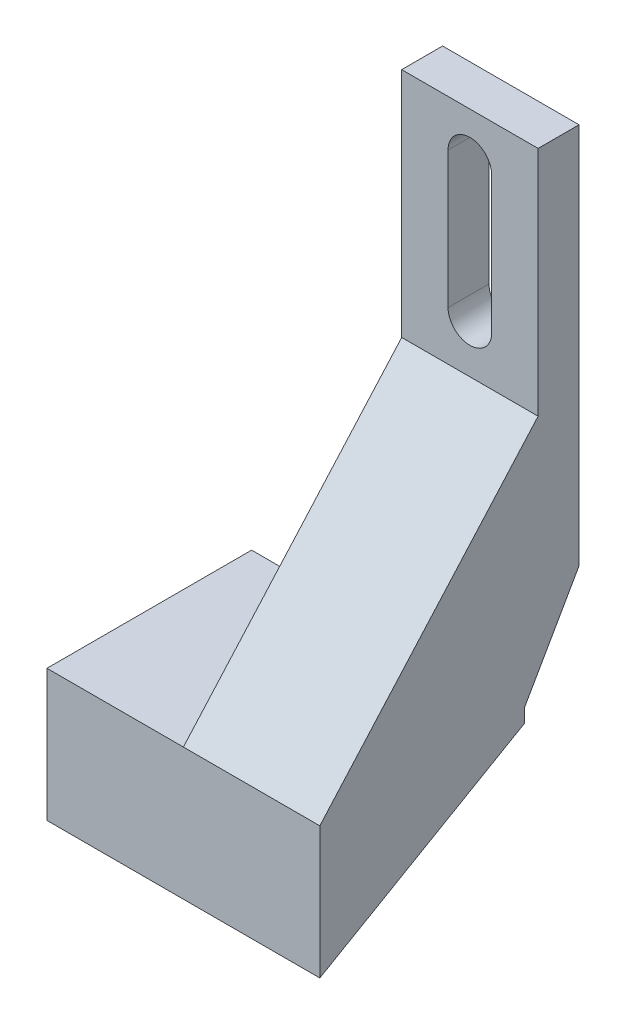
ISO-10303-21;
HEADER;
FILE_DESCRIPTION(('STEP AP214'),'2;1');
FILE_NAME('part.step','',(''),(''),'','','');
FILE_SCHEMA(('AUTOMOTIVE_DESIGN { 1 0 10303 214 1 1 1 1 }'));
ENDSEC;
DATA;
#1=APPLICATION_CONTEXT('core data for automotive mechanical design processes');
#2=APPLICATION_PROTOCOL_DEFINITION('international standard','automotive_design',2000,#1);
#3=PRODUCT_CONTEXT('',#1,'mechanical');
#4=PRODUCT('Part','Part','',(#3));
#5=PRODUCT_RELATED_PRODUCT_CATEGORY('part','',(#4));
#6=PRODUCT_DEFINITION_FORMATION('','',#4);
#7=PRODUCT_DEFINITION_CONTEXT('part definition',#1,'design');
#8=PRODUCT_DEFINITION('design','',#6,#7);
#9=PRODUCT_DEFINITION_SHAPE('','',#8);
#10=(LENGTH_UNIT() NAMED_UNIT(*) SI_UNIT(.MILLI.,.METRE.));
#11=(NAMED_UNIT(*) PLANE_ANGLE_UNIT() SI_UNIT($,.RADIAN.));
#12=(NAMED_UNIT(*) SI_UNIT($,.STERADIAN.) SOLID_ANGLE_UNIT());
#13=UNCERTAINTY_MEASURE_WITH_UNIT(LENGTH_MEASURE(1.E-05),#10,'distance_accuracy_value','');
#14=(GEOMETRIC_REPRESENTATION_CONTEXT(3) GLOBAL_UNCERTAINTY_ASSIGNED_CONTEXT((#13)) GLOBAL_UNIT_ASSIGNED_CONTEXT((#10,
#11,#12)) REPRESENTATION_CONTEXT('',''));
#15=CARTESIAN_POINT('',(0.,0.,0.));
#16=DIRECTION('',(0.,0.,1.));
#17=DIRECTION('',(1.,0.,0.));
#18=AXIS2_PLACEMENT_3D('',#15,#16,#17);
#19=CARTESIAN_POINT('',(0.,0.,3.));
#20=DIRECTION('',(0.,0.,1.));
#21=DIRECTION('',(1.,0.,0.));
#22=AXIS2_PLACEMENT_3D('',#19,#20,#21);
#23=PLANE('',#22);
#24=CARTESIAN_POINT('',(0.,21.6,3.));
#25=DIRECTION('',(0.,0.,1.));
#26=DIRECTION('',(1.,0.,0.));
#27=AXIS2_PLACEMENT_3D('',#24,#25,#26);
#28=CIRCLE('',#27,1.6);
#29=CARTESIAN_POINT('',(-1.6,21.6,3.));
#30=VERTEX_POINT('',#29);
#31=CARTESIAN_POINT('',(1.6,21.6,3.));
#32=VERTEX_POINT('',#31);
#33=EDGE_CURVE('E189',#30,#32,#28,.T.);
#34=ORIENTED_EDGE('',*,*,#33,.F.);
#35=DIRECTION('',(0.,-1.,0.));
#36=VECTOR('',#35,1.);
#37=CARTESIAN_POINT('',(-1.6,0.,3.));
#38=LINE('',#37,#36);
#39=CARTESIAN_POINT('',(-1.6,31.6,3.));
#40=VERTEX_POINT('',#39);
#41=EDGE_CURVE('E192',#40,#30,#38,.T.);
#42=ORIENTED_EDGE('',*,*,#41,.F.);
#43=CARTESIAN_POINT('',(0.,31.6,3.));
#44=DIRECTION('',(0.,0.,1.));
#45=DIRECTION('',(1.,0.,0.));
#46=AXIS2_PLACEMENT_3D('',#43,#44,#45);
#47=CIRCLE('',#46,1.6);
#48=CARTESIAN_POINT('',(1.6,31.6,3.));
#49=VERTEX_POINT('',#48);
#50=EDGE_CURVE('E196',#49,#40,#47,.T.);
#51=ORIENTED_EDGE('',*,*,#50,.F.);
#52=DIRECTION('',(0.,-1.,0.));
#53=VECTOR('',#52,1.);
#54=CARTESIAN_POINT('',(1.6,0.,3.));
#55=LINE('',#54,#53);
#56=EDGE_CURVE('E199',#49,#32,#55,.T.);
#57=ORIENTED_EDGE('',*,*,#56,.T.);
#58=EDGE_LOOP('',(#34,#42,#51,#57));
#59=FACE_BOUND('',#58,.T.);
#60=DIRECTION('',(0.,1.,0.));
#61=VECTOR('',#60,1.);
#62=CARTESIAN_POINT('',(-5.,0.,3.));
#63=LINE('',#62,#61);
#64=CARTESIAN_POINT('',(-5.,18.,3.));
#65=VERTEX_POINT('',#64);
#66=CARTESIAN_POINT('',(-5.,35.,3.));
#67=VERTEX_POINT('',#66);
#68=EDGE_CURVE('E58',#65,#67,#63,.T.);
#69=ORIENTED_EDGE('',*,*,#68,.F.);
#70=DIRECTION('',(-1.,0.,0.));
#71=VECTOR('',#70,1.);
#72=CARTESIAN_POINT('',(31.1725046566048,18.,3.));
#73=LINE('',#72,#71);
#74=CARTESIAN_POINT('',(5.,18.,3.));
#75=VERTEX_POINT('',#74);
#76=EDGE_CURVE('E53',#75,#65,#73,.T.);
#77=ORIENTED_EDGE('',*,*,#76,.F.);
#78=DIRECTION('',(0.,1.,0.));
#79=VECTOR('',#78,1.);
#80=CARTESIAN_POINT('',(5.,0.,3.));
#81=LINE('',#80,#79);
#82=CARTESIAN_POINT('',(5.,35.,3.));
#83=VERTEX_POINT('',#82);
#84=EDGE_CURVE('E202',#75,#83,#81,.T.);
#85=ORIENTED_EDGE('',*,*,#84,.T.);
#86=DIRECTION('',(1.,0.,0.));
#87=VECTOR('',#86,1.);
#88=CARTESIAN_POINT('',(0.,35.,3.));
#89=LINE('',#88,#87);
#90=EDGE_CURVE('E204',#67,#83,#89,.T.);
#91=ORIENTED_EDGE('',*,*,#90,.F.);
#92=EDGE_LOOP('',(#69,#77,#85,#91));
#93=FACE_BOUND('',#92,.T.);
#94=ADVANCED_FACE('F36',(#59,#93),#23,.T.);
#95=CARTESIAN_POINT('',(-5.,0.,3.));
#96=DIRECTION('',(-1.,0.,0.));
#97=DIRECTION('',(0.,0.,1.));
#98=AXIS2_PLACEMENT_3D('',#95,#96,#97);
#99=PLANE('',#98);
#100=DIRECTION('',(0.,-0.74740931868366,0.66436383882992));
#101=VECTOR('',#100,1.);
#102=CARTESIAN_POINT('',(-5.,9.43448275862069,10.6137931034483));
#103=LINE('',#102,#101);
#104=CARTESIAN_POINT('',(-5.,0.,19.));
#105=VERTEX_POINT('',#104);
#106=EDGE_CURVE('E154',#65,#105,#103,.T.);
#107=ORIENTED_EDGE('',*,*,#106,.F.);
#108=ORIENTED_EDGE('',*,*,#68,.T.);
#109=DIRECTION('',(0.,0.,-1.));
#110=VECTOR('',#109,1.);
#111=CARTESIAN_POINT('',(-5.,35.,3.));
#112=LINE('',#111,#110);
#113=CARTESIAN_POINT('',(-5.,35.,0.));
#114=VERTEX_POINT('',#113);
#115=EDGE_CURVE('E45',#67,#114,#112,.T.);
#116=ORIENTED_EDGE('',*,*,#115,.T.);
#117=DIRECTION('',(0.,1.,0.));
#118=VECTOR('',#117,1.);
#119=CARTESIAN_POINT('',(-5.,0.,0.));
#120=LINE('',#119,#118);
#121=CARTESIAN_POINT('',(-5.,7.,0.));
#122=VERTEX_POINT('',#121);
#123=EDGE_CURVE('E219',#122,#114,#120,.T.);
#124=ORIENTED_EDGE('',*,*,#123,.F.);
#125=DIRECTION('',(0.,-0.868243142124459,0.496138938356834));
#126=VECTOR('',#125,1.);
#127=CARTESIAN_POINT('',(-5.,1.72307692307692,3.01538461538461));
#128=LINE('',#127,#126);
#129=CARTESIAN_POINT('',(-5.,0.,4.));
#130=VERTEX_POINT('',#129);
#131=EDGE_CURVE('E424',#122,#130,#128,.T.);
#132=ORIENTED_EDGE('',*,*,#131,.T.);
#133=DIRECTION('',(0.,0.,-1.));
#134=VECTOR('',#133,1.);
#135=CARTESIAN_POINT('',(-5.,0.,0.));
#136=LINE('',#135,#134);
#137=EDGE_CURVE('E142',#105,#130,#136,.T.);
#138=ORIENTED_EDGE('',*,*,#137,.F.);
#139=EDGE_LOOP('',(#107,#108,#116,#124,#132,#138));
#140=FACE_BOUND('',#139,.T.);
#141=ADVANCED_FACE('F251',(#140),#99,.T.);
#142=CARTESIAN_POINT('',(5.,0.,3.));
#143=DIRECTION('',(-1.,0.,0.));
#144=DIRECTION('',(0.,-1.,0.));
#145=AXIS2_PLACEMENT_3D('',#142,#143,#144);
#146=PLANE('',#145);
#147=DIRECTION('',(0.,0.868243142124459,-0.496138938356834));
#148=VECTOR('',#147,1.);
#149=CARTESIAN_POINT('',(5.,1.72307692307692,3.01538461538462));
#150=LINE('',#149,#148);
#151=CARTESIAN_POINT('',(5.,0.,4.));
#152=VERTEX_POINT('',#151);
#153=CARTESIAN_POINT('',(5.,7.,0.));
#154=VERTEX_POINT('',#153);
#155=EDGE_CURVE('E135',#152,#154,#150,.T.);
#156=ORIENTED_EDGE('',*,*,#155,.T.);
#157=DIRECTION('',(0.,1.,0.));
#158=VECTOR('',#157,1.);
#159=CARTESIAN_POINT('',(5.,0.,0.));
#160=LINE('',#159,#158);
#161=CARTESIAN_POINT('',(5.,35.,0.));
#162=VERTEX_POINT('',#161);
#163=EDGE_CURVE('E222',#154,#162,#160,.T.);
#164=ORIENTED_EDGE('',*,*,#163,.T.);
#165=DIRECTION('',(0.,0.,-1.));
#166=VECTOR('',#165,1.);
#167=CARTESIAN_POINT('',(5.,35.,3.));
#168=LINE('',#167,#166);
#169=EDGE_CURVE('E11',#83,#162,#168,.T.);
#170=ORIENTED_EDGE('',*,*,#169,.F.);
#171=ORIENTED_EDGE('',*,*,#84,.F.);
#172=DIRECTION('',(0.,0.74740931868366,-0.66436383882992));
#173=VECTOR('',#172,1.);
#174=CARTESIAN_POINT('',(5.,9.43448275862069,10.6137931034483));
#175=LINE('',#174,#173);
#176=CARTESIAN_POINT('',(5.,0.,19.));
#177=VERTEX_POINT('',#176);
#178=EDGE_CURVE('E160',#177,#75,#175,.T.);
#179=ORIENTED_EDGE('',*,*,#178,.F.);
#180=DIRECTION('',(0.,1.,0.));
#181=VECTOR('',#180,1.);
#182=CARTESIAN_POINT('',(5.,0.,19.));
#183=LINE('',#182,#181);
#184=CARTESIAN_POINT('',(5.00000000000001,-9.66025403784427,19.));
#185=VERTEX_POINT('',#184);
#186=EDGE_CURVE('E159',#185,#177,#183,.T.);
#187=ORIENTED_EDGE('',*,*,#186,.F.);
#188=DIRECTION('',(0.,-0.499999999999995,0.866025403784442));
#189=VECTOR('',#188,1.);
#190=CARTESIAN_POINT('',(5.,0.982050807568862,0.566987298107764));
#191=LINE('',#190,#189);
#192=CARTESIAN_POINT('',(5.,-0.999999999999999,4.));
#193=VERTEX_POINT('',#192);
#194=EDGE_CURVE('E138',#193,#185,#191,.T.);
#195=ORIENTED_EDGE('',*,*,#194,.F.);
#196=DIRECTION('',(0.,-1.,0.));
#197=VECTOR('',#196,1.);
#198=CARTESIAN_POINT('',(5.,0.,4.));
#199=LINE('',#198,#197);
#200=EDGE_CURVE('E130',#152,#193,#199,.T.);
#201=ORIENTED_EDGE('',*,*,#200,.F.);
#202=EDGE_LOOP('',(#156,#164,#170,#171,#179,#187,#195,#201));
#203=FACE_BOUND('',#202,.T.);
#204=ADVANCED_FACE('F132',(#203),#146,.F.);
#205=CARTESIAN_POINT('',(0.,21.6,3.));
#206=DIRECTION('',(0.,0.,-1.));
#207=DIRECTION('',(-1.,0.,0.));
#208=AXIS2_PLACEMENT_3D('',#205,#206,#207);
#209=CYLINDRICAL_SURFACE('',#208,1.6);
#210=CARTESIAN_POINT('',(0.,21.6,0.));
#211=DIRECTION('',(0.,0.,1.));
#212=DIRECTION('',(1.,0.,0.));
#213=AXIS2_PLACEMENT_3D('',#210,#211,#212);
#214=CIRCLE('',#213,1.6);
#215=CARTESIAN_POINT('',(-1.6,21.6,0.));
#216=VERTEX_POINT('',#215);
#217=CARTESIAN_POINT('',(1.6,21.6,0.));
#218=VERTEX_POINT('',#217);
#219=EDGE_CURVE('E188',#216,#218,#214,.T.);
#220=ORIENTED_EDGE('',*,*,#219,.F.);
#221=DIRECTION('',(0.,0.,-1.));
#222=VECTOR('',#221,1.);
#223=CARTESIAN_POINT('',(-1.6,21.6,3.));
#224=LINE('',#223,#222);
#225=EDGE_CURVE('E40',#30,#216,#224,.T.);
#226=ORIENTED_EDGE('',*,*,#225,.F.);
#227=ORIENTED_EDGE('',*,*,#33,.T.);
#228=DIRECTION('',(0.,0.,-1.));
#229=VECTOR('',#228,1.);
#230=CARTESIAN_POINT('',(1.6,21.6,3.));
#231=LINE('',#230,#229);
#232=EDGE_CURVE('E207',#32,#218,#231,.T.);
#233=ORIENTED_EDGE('',*,*,#232,.T.);
#234=EDGE_LOOP('',(#220,#226,#227,#233));
#235=FACE_BOUND('',#234,.T.);
#236=ADVANCED_FACE('F38',(#235),#209,.F.);
#237=CARTESIAN_POINT('',(-1.6,0.,3.));
#238=DIRECTION('',(1.,0.,0.));
#239=DIRECTION('',(0.,1.,0.));
#240=AXIS2_PLACEMENT_3D('',#237,#238,#239);
#241=PLANE('',#240);
#242=DIRECTION('',(0.,-1.,0.));
#243=VECTOR('',#242,1.);
#244=CARTESIAN_POINT('',(-1.6,0.,0.));
#245=LINE('',#244,#243);
#246=CARTESIAN_POINT('',(-1.6,31.6,0.));
#247=VERTEX_POINT('',#246);
#248=EDGE_CURVE('E210',#247,#216,#245,.T.);
#249=ORIENTED_EDGE('',*,*,#248,.F.);
#250=DIRECTION('',(0.,0.,-1.));
#251=VECTOR('',#250,1.);
#252=CARTESIAN_POINT('',(-1.6,31.6,3.));
#253=LINE('',#252,#251);
#254=EDGE_CURVE('E229',#40,#247,#253,.T.);
#255=ORIENTED_EDGE('',*,*,#254,.F.);
#256=ORIENTED_EDGE('',*,*,#41,.T.);
#257=ORIENTED_EDGE('',*,*,#225,.T.);
#258=EDGE_LOOP('',(#249,#255,#256,#257));
#259=FACE_BOUND('',#258,.T.);
#260=ADVANCED_FACE('F235',(#259),#241,.T.);
#261=CARTESIAN_POINT('',(0.,31.6,3.));
#262=DIRECTION('',(0.,0.,-1.));
#263=DIRECTION('',(-1.,0.,0.));
#264=AXIS2_PLACEMENT_3D('',#261,#262,#263);
#265=CYLINDRICAL_SURFACE('',#264,1.6);
#266=CARTESIAN_POINT('',(0.,31.6,0.));
#267=DIRECTION('',(0.,0.,1.));
#268=DIRECTION('',(1.,0.,0.));
#269=AXIS2_PLACEMENT_3D('',#266,#267,#268);
#270=CIRCLE('',#269,1.6);
#271=CARTESIAN_POINT('',(1.6,31.6,0.));
#272=VERTEX_POINT('',#271);
#273=EDGE_CURVE('E213',#272,#247,#270,.T.);
#274=ORIENTED_EDGE('',*,*,#273,.F.);
#275=DIRECTION('',(0.,0.,-1.));
#276=VECTOR('',#275,1.);
#277=CARTESIAN_POINT('',(1.6,31.6,3.));
#278=LINE('',#277,#276);
#279=EDGE_CURVE('E228',#49,#272,#278,.T.);
#280=ORIENTED_EDGE('',*,*,#279,.F.);
#281=ORIENTED_EDGE('',*,*,#50,.T.);
#282=ORIENTED_EDGE('',*,*,#254,.T.);
#283=EDGE_LOOP('',(#274,#280,#281,#282));
#284=FACE_BOUND('',#283,.T.);
#285=ADVANCED_FACE('F244',(#284),#265,.F.);
#286=CARTESIAN_POINT('',(1.6,0.,3.));
#287=DIRECTION('',(1.,0.,0.));
#288=DIRECTION('',(0.,1.,0.));
#289=AXIS2_PLACEMENT_3D('',#286,#287,#288);
#290=PLANE('',#289);
#291=DIRECTION('',(0.,-1.,0.));
#292=VECTOR('',#291,1.);
#293=CARTESIAN_POINT('',(1.6,0.,0.));
#294=LINE('',#293,#292);
#295=EDGE_CURVE('E216',#272,#218,#294,.T.);
#296=ORIENTED_EDGE('',*,*,#295,.T.);
#297=ORIENTED_EDGE('',*,*,#232,.F.);
#298=ORIENTED_EDGE('',*,*,#56,.F.);
#299=ORIENTED_EDGE('',*,*,#279,.T.);
#300=EDGE_LOOP('',(#296,#297,#298,#299));
#301=FACE_BOUND('',#300,.T.);
#302=ADVANCED_FACE('F248',(#301),#290,.F.);
#303=CARTESIAN_POINT('',(0.,35.,3.));
#304=DIRECTION('',(0.,1.,0.));
#305=DIRECTION('',(0.,0.,1.));
#306=AXIS2_PLACEMENT_3D('',#303,#304,#305);
#307=PLANE('',#306);
#308=DIRECTION('',(1.,0.,0.));
#309=VECTOR('',#308,1.);
#310=CARTESIAN_POINT('',(0.,35.,0.));
#311=LINE('',#310,#309);
#312=EDGE_CURVE('E193',#114,#162,#311,.T.);
#313=ORIENTED_EDGE('',*,*,#312,.F.);
#314=ORIENTED_EDGE('',*,*,#115,.F.);
#315=ORIENTED_EDGE('',*,*,#90,.T.);
#316=ORIENTED_EDGE('',*,*,#169,.T.);
#317=EDGE_LOOP('',(#313,#314,#315,#316));
#318=FACE_BOUND('',#317,.T.);
#319=ADVANCED_FACE('F263',(#318),#307,.T.);
#320=CARTESIAN_POINT('',(0.,0.,0.));
#321=DIRECTION('',(0.,0.,1.));
#322=DIRECTION('',(1.,0.,0.));
#323=AXIS2_PLACEMENT_3D('',#320,#321,#322);
#324=PLANE('',#323);
#325=ORIENTED_EDGE('',*,*,#219,.T.);
#326=ORIENTED_EDGE('',*,*,#295,.F.);
#327=ORIENTED_EDGE('',*,*,#273,.T.);
#328=ORIENTED_EDGE('',*,*,#248,.T.);
#329=EDGE_LOOP('',(#325,#326,#327,#328));
#330=FACE_BOUND('',#329,.T.);
#331=ORIENTED_EDGE('',*,*,#123,.T.);
#332=ORIENTED_EDGE('',*,*,#312,.T.);
#333=ORIENTED_EDGE('',*,*,#163,.F.);
#334=DIRECTION('',(1.,0.,0.));
#335=VECTOR('',#334,1.);
#336=CARTESIAN_POINT('',(-5.,7.,0.));
#337=LINE('',#336,#335);
#338=EDGE_CURVE('E158',#122,#154,#337,.T.);
#339=ORIENTED_EDGE('',*,*,#338,.F.);
#340=EDGE_LOOP('',(#331,#332,#333,#339));
#341=FACE_BOUND('',#340,.T.);
#342=ADVANCED_FACE('F242',(#330,#341),#324,.F.);
#343=CARTESIAN_POINT('',(-5.,0.,4.));
#344=DIRECTION('',(0.,0.,1.));
#345=DIRECTION('',(0.,-1.,0.));
#346=AXIS2_PLACEMENT_3D('',#343,#344,#345);
#347=PLANE('',#346);
#348=DIRECTION('',(1.,0.,0.));
#349=VECTOR('',#348,1.);
#350=CARTESIAN_POINT('',(-15.,0.,4.));
#351=LINE('',#350,#349);
#352=CARTESIAN_POINT('',(-15.,0.,4.));
#353=VERTEX_POINT('',#352);
#354=EDGE_CURVE('E143',#353,#130,#351,.T.);
#355=ORIENTED_EDGE('',*,*,#354,.T.);
#356=DIRECTION('',(-1.,0.,0.));
#357=VECTOR('',#356,1.);
#358=CARTESIAN_POINT('',(31.1725046566048,0.,4.));
#359=LINE('',#358,#357);
#360=EDGE_CURVE('E147',#152,#130,#359,.T.);
#361=ORIENTED_EDGE('',*,*,#360,.F.);
#362=ORIENTED_EDGE('',*,*,#200,.T.);
#363=DIRECTION('',(1.,0.,0.));
#364=VECTOR('',#363,1.);
#365=CARTESIAN_POINT('',(-15.,-1.,4.));
#366=LINE('',#365,#364);
#367=CARTESIAN_POINT('',(-15.,-1.,4.));
#368=VERTEX_POINT('',#367);
#369=EDGE_CURVE('E179',#368,#193,#366,.T.);
#370=ORIENTED_EDGE('',*,*,#369,.F.);
#371=DIRECTION('',(0.,-1.,0.));
#372=VECTOR('',#371,1.);
#373=CARTESIAN_POINT('',(-15.,0.,4.));
#374=LINE('',#373,#372);
#375=EDGE_CURVE('E174',#353,#368,#374,.T.);
#376=ORIENTED_EDGE('',*,*,#375,.F.);
#377=EDGE_LOOP('',(#355,#361,#362,#370,#376));
#378=FACE_BOUND('',#377,.T.);
#379=ADVANCED_FACE('F148',(#378),#347,.F.);
#380=CARTESIAN_POINT('',(-15.,0.,0.));
#381=DIRECTION('',(0.,-1.,0.));
#382=DIRECTION('',(1.,0.,0.));
#383=AXIS2_PLACEMENT_3D('',#380,#381,#382);
#384=PLANE('',#383);
#385=DIRECTION('',(1.,0.,0.));
#386=VECTOR('',#385,1.);
#387=CARTESIAN_POINT('',(-15.,0.,19.));
#388=LINE('',#387,#386);
#389=CARTESIAN_POINT('',(-15.,0.,19.));
#390=VERTEX_POINT('',#389);
#391=EDGE_CURVE('E175',#390,#105,#388,.T.);
#392=ORIENTED_EDGE('',*,*,#391,.T.);
#393=ORIENTED_EDGE('',*,*,#137,.T.);
#394=ORIENTED_EDGE('',*,*,#354,.F.);
#395=DIRECTION('',(0.,0.,-1.));
#396=VECTOR('',#395,1.);
#397=CARTESIAN_POINT('',(-15.,0.,0.));
#398=LINE('',#397,#396);
#399=EDGE_CURVE('E167',#390,#353,#398,.T.);
#400=ORIENTED_EDGE('',*,*,#399,.F.);
#401=EDGE_LOOP('',(#392,#393,#394,#400));
#402=FACE_BOUND('',#401,.T.);
#403=ADVANCED_FACE('F318',(#402),#384,.F.);
#404=CARTESIAN_POINT('',(-15.,0.982050807568859,0.566987298107764));
#405=DIRECTION('',(0.,0.866025403784442,0.499999999999995));
#406=DIRECTION('',(0.,-0.499999999999995,0.866025403784442));
#407=AXIS2_PLACEMENT_3D('',#404,#405,#406);
#408=PLANE('',#407);
#409=ORIENTED_EDGE('',*,*,#194,.T.);
#410=DIRECTION('',(1.,0.,0.));
#411=VECTOR('',#410,1.);
#412=CARTESIAN_POINT('',(-15.,-9.66025403784428,19.));
#413=LINE('',#412,#411);
#414=CARTESIAN_POINT('',(-15.,-9.66025403784428,19.));
#415=VERTEX_POINT('',#414);
#416=EDGE_CURVE('E181',#415,#185,#413,.T.);
#417=ORIENTED_EDGE('',*,*,#416,.F.);
#418=DIRECTION('',(0.,-0.499999999999995,0.866025403784442));
#419=VECTOR('',#418,1.);
#420=CARTESIAN_POINT('',(-15.,0.982050807568859,0.566987298107764));
#421=LINE('',#420,#419);
#422=EDGE_CURVE('E172',#368,#415,#421,.T.);
#423=ORIENTED_EDGE('',*,*,#422,.F.);
#424=ORIENTED_EDGE('',*,*,#369,.T.);
#425=EDGE_LOOP('',(#409,#417,#423,#424));
#426=FACE_BOUND('',#425,.T.);
#427=ADVANCED_FACE('F313',(#426),#408,.F.);
#428=CARTESIAN_POINT('',(-15.,0.,19.));
#429=DIRECTION('',(0.,0.,-1.));
#430=DIRECTION('',(0.,1.,0.));
#431=AXIS2_PLACEMENT_3D('',#428,#429,#430);
#432=PLANE('',#431);
#433=ORIENTED_EDGE('',*,*,#186,.T.);
#434=DIRECTION('',(-1.,0.,0.));
#435=VECTOR('',#434,1.);
#436=CARTESIAN_POINT('',(31.1725046566048,0.,19.));
#437=LINE('',#436,#435);
#438=EDGE_CURVE('E153',#177,#105,#437,.T.);
#439=ORIENTED_EDGE('',*,*,#438,.T.);
#440=ORIENTED_EDGE('',*,*,#391,.F.);
#441=DIRECTION('',(0.,1.,0.));
#442=VECTOR('',#441,1.);
#443=CARTESIAN_POINT('',(-15.,0.,19.));
#444=LINE('',#443,#442);
#445=EDGE_CURVE('E170',#415,#390,#444,.T.);
#446=ORIENTED_EDGE('',*,*,#445,.F.);
#447=ORIENTED_EDGE('',*,*,#416,.T.);
#448=EDGE_LOOP('',(#433,#439,#440,#446,#447));
#449=FACE_BOUND('',#448,.T.);
#450=ADVANCED_FACE('F304',(#449),#432,.F.);
#451=CARTESIAN_POINT('',(-15.,0.,0.));
#452=DIRECTION('',(1.,0.,0.));
#453=DIRECTION('',(0.,1.,0.));
#454=AXIS2_PLACEMENT_3D('',#451,#452,#453);
#455=PLANE('',#454);
#456=ORIENTED_EDGE('',*,*,#399,.T.);
#457=ORIENTED_EDGE('',*,*,#375,.T.);
#458=ORIENTED_EDGE('',*,*,#422,.T.);
#459=ORIENTED_EDGE('',*,*,#445,.T.);
#460=EDGE_LOOP('',(#456,#457,#458,#459));
#461=FACE_BOUND('',#460,.T.);
#462=ADVANCED_FACE('F299',(#461),#455,.F.);
#463=CARTESIAN_POINT('',(31.1725046566048,9.43448275862069,10.6137931034483));
#464=DIRECTION('',(0.,-0.66436383882992,-0.74740931868366));
#465=DIRECTION('',(0.,0.74740931868366,-0.66436383882992));
#466=AXIS2_PLACEMENT_3D('',#463,#464,#465);
#467=PLANE('',#466);
#468=ORIENTED_EDGE('',*,*,#438,.F.);
#469=ORIENTED_EDGE('',*,*,#178,.T.);
#470=ORIENTED_EDGE('',*,*,#76,.T.);
#471=ORIENTED_EDGE('',*,*,#106,.T.);
#472=EDGE_LOOP('',(#468,#469,#470,#471));
#473=FACE_BOUND('',#472,.T.);
#474=ADVANCED_FACE('F303',(#473),#467,.F.);
#475=CARTESIAN_POINT('',(31.1725046566048,1.72307692307692,3.01538461538461));
#476=DIRECTION('',(0.,-0.496138938356834,-0.868243142124459));
#477=DIRECTION('',(0.,0.868243142124459,-0.496138938356834));
#478=AXIS2_PLACEMENT_3D('',#475,#476,#477);
#479=PLANE('',#478);
#480=ORIENTED_EDGE('',*,*,#155,.F.);
#481=ORIENTED_EDGE('',*,*,#360,.T.);
#482=ORIENTED_EDGE('',*,*,#131,.F.);
#483=ORIENTED_EDGE('',*,*,#338,.T.);
#484=EDGE_LOOP('',(#480,#481,#482,#483));
#485=FACE_BOUND('',#484,.T.);
#486=ADVANCED_FACE('F156',(#485),#479,.T.);
#487=CLOSED_SHELL('',(#94,#141,#204,#236,#260,#285,#302,#319,#342,#379,#403,#427,#450,#462,#474,#486));
#488=MANIFOLD_SOLID_BREP('B2',#487);
#489=ADVANCED_BREP_SHAPE_REPRESENTATION('',(#18,#488),#14);
#490=SHAPE_DEFINITION_REPRESENTATION(#9,#489);
ENDSEC;
END-ISO-10303-21;
